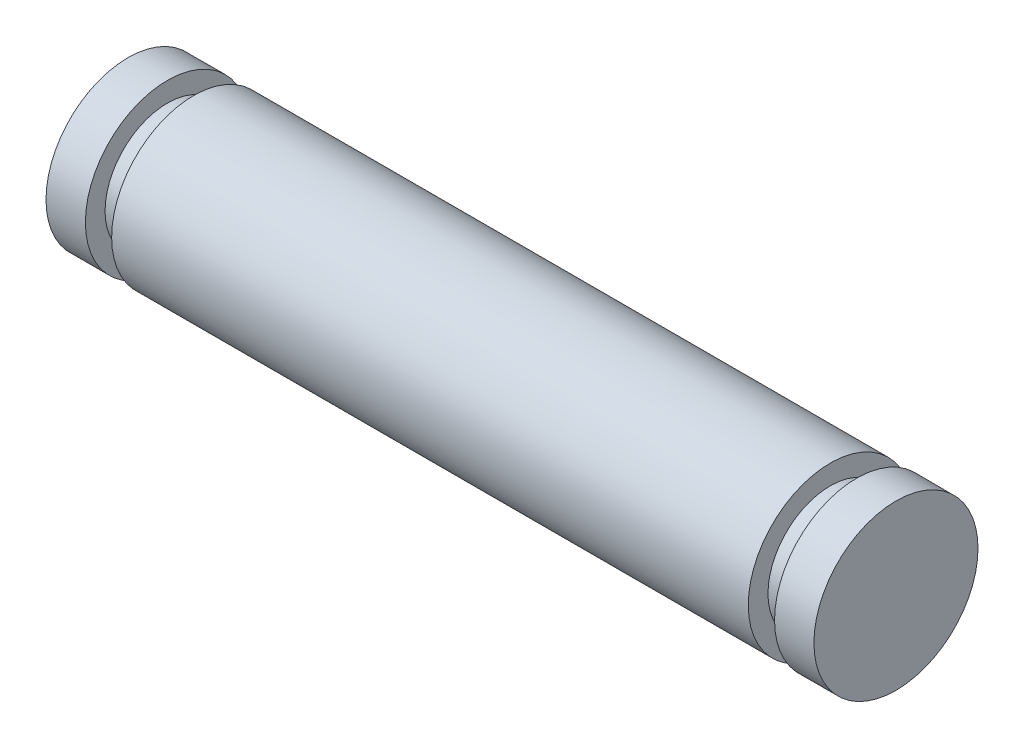
ISO-10303-21;
HEADER;
FILE_DESCRIPTION(('STEP AP214'),'2;1');
FILE_NAME('part.step','',(''),(''),'','','');
FILE_SCHEMA(('AUTOMOTIVE_DESIGN { 1 0 10303 214 1 1 1 1 }'));
ENDSEC;
DATA;
#1=APPLICATION_CONTEXT('core data for automotive mechanical design processes');
#2=APPLICATION_PROTOCOL_DEFINITION('international standard','automotive_design',2000,#1);
#3=PRODUCT_CONTEXT('',#1,'mechanical');
#4=PRODUCT('Part','Part','',(#3));
#5=PRODUCT_RELATED_PRODUCT_CATEGORY('part','',(#4));
#6=PRODUCT_DEFINITION_FORMATION('','',#4);
#7=PRODUCT_DEFINITION_CONTEXT('part definition',#1,'design');
#8=PRODUCT_DEFINITION('design','',#6,#7);
#9=PRODUCT_DEFINITION_SHAPE('','',#8);
#10=(LENGTH_UNIT() NAMED_UNIT(*) SI_UNIT(.MILLI.,.METRE.));
#11=(NAMED_UNIT(*) PLANE_ANGLE_UNIT() SI_UNIT($,.RADIAN.));
#12=(NAMED_UNIT(*) SI_UNIT($,.STERADIAN.) SOLID_ANGLE_UNIT());
#13=UNCERTAINTY_MEASURE_WITH_UNIT(LENGTH_MEASURE(1.E-05),#10,'distance_accuracy_value','');
#14=(GEOMETRIC_REPRESENTATION_CONTEXT(3) GLOBAL_UNCERTAINTY_ASSIGNED_CONTEXT((#13)) GLOBAL_UNIT_ASSIGNED_CONTEXT((#10,
#11,#12)) REPRESENTATION_CONTEXT('',''));
#15=CARTESIAN_POINT('',(0.,0.,0.));
#16=DIRECTION('',(0.,0.,1.));
#17=DIRECTION('',(1.,0.,0.));
#18=AXIS2_PLACEMENT_3D('',#15,#16,#17);
#19=CARTESIAN_POINT('',(7.4295,0.,0.));
#20=DIRECTION('',(-1.,0.,0.));
#21=DIRECTION('',(0.,0.,1.));
#22=AXIS2_PLACEMENT_3D('',#19,#20,#21);
#23=CYLINDRICAL_SURFACE('',#22,1.5875);
#24=CARTESIAN_POINT('',(-6.1595,0.,0.));
#25=DIRECTION('',(-1.,0.,0.));
#26=DIRECTION('',(0.,0.,1.));
#27=AXIS2_PLACEMENT_3D('',#24,#25,#26);
#28=CIRCLE('',#27,1.5875);
#29=CARTESIAN_POINT('',(-6.1595,0.,1.5875));
#30=VERTEX_POINT('',#29);
#31=EDGE_CURVE('E390',#30,#30,#28,.T.);
#32=ORIENTED_EDGE('',*,*,#31,.F.);
#33=EDGE_LOOP('',(#32));
#34=FACE_BOUND('',#33,.T.);
#35=CARTESIAN_POINT('',(6.1595,0.,0.));
#36=DIRECTION('',(-1.,0.,0.));
#37=DIRECTION('',(0.,0.,1.));
#38=AXIS2_PLACEMENT_3D('',#35,#36,#37);
#39=CIRCLE('',#38,1.5875);
#40=CARTESIAN_POINT('',(6.1595,0.,1.5875));
#41=VERTEX_POINT('',#40);
#42=EDGE_CURVE('E405',#41,#41,#39,.T.);
#43=ORIENTED_EDGE('',*,*,#42,.T.);
#44=EDGE_LOOP('',(#43));
#45=FACE_BOUND('',#44,.T.);
#46=ADVANCED_FACE('F370',(#34,#45),#23,.T.);
#47=CARTESIAN_POINT('',(-7.4295,0.,0.));
#48=DIRECTION('',(1.,0.,0.));
#49=DIRECTION('',(0.,0.,-1.));
#50=AXIS2_PLACEMENT_3D('',#47,#48,#49);
#51=CIRCLE('',#50,1.5875);
#52=CARTESIAN_POINT('',(-7.4295,0.,-1.5875));
#53=VERTEX_POINT('',#52);
#54=EDGE_CURVE('E377',#53,#53,#51,.T.);
#55=ORIENTED_EDGE('',*,*,#54,.T.);
#56=EDGE_LOOP('',(#55));
#57=FACE_BOUND('',#56,.T.);
#58=CARTESIAN_POINT('',(-6.6675,0.,0.));
#59=DIRECTION('',(-1.,0.,0.));
#60=DIRECTION('',(0.,0.,1.));
#61=AXIS2_PLACEMENT_3D('',#58,#59,#60);
#62=CIRCLE('',#61,1.5875);
#63=CARTESIAN_POINT('',(-6.6675,0.,1.5875));
#64=VERTEX_POINT('',#63);
#65=EDGE_CURVE('E393',#64,#64,#62,.T.);
#66=ORIENTED_EDGE('',*,*,#65,.T.);
#67=EDGE_LOOP('',(#66));
#68=FACE_BOUND('',#67,.T.);
#69=ADVANCED_FACE('F372',(#57,#68),#23,.T.);
#70=CARTESIAN_POINT('',(-7.4295,0.,0.));
#71=DIRECTION('',(1.,0.,0.));
#72=DIRECTION('',(0.,0.,-1.));
#73=AXIS2_PLACEMENT_3D('',#70,#71,#72);
#74=PLANE('',#73);
#75=ORIENTED_EDGE('',*,*,#54,.F.);
#76=EDGE_LOOP('',(#75));
#77=FACE_BOUND('',#76,.T.);
#78=ADVANCED_FACE('F433',(#77),#74,.F.);
#79=CARTESIAN_POINT('',(-6.6675,1.5875,0.));
#80=DIRECTION('',(1.,0.,0.));
#81=DIRECTION('',(0.,0.,-1.));
#82=AXIS2_PLACEMENT_3D('',#79,#80,#81);
#83=PLANE('',#82);
#84=CARTESIAN_POINT('',(-6.6675,0.,0.));
#85=DIRECTION('',(-1.,0.,0.));
#86=DIRECTION('',(0.,0.,1.));
#87=AXIS2_PLACEMENT_3D('',#84,#85,#86);
#88=CIRCLE('',#87,1.2065);
#89=CARTESIAN_POINT('',(-6.6675,0.,1.2065));
#90=VERTEX_POINT('',#89);
#91=EDGE_CURVE('E381',#90,#90,#88,.T.);
#92=ORIENTED_EDGE('',*,*,#91,.T.);
#93=EDGE_LOOP('',(#92));
#94=FACE_BOUND('',#93,.T.);
#95=ORIENTED_EDGE('',*,*,#65,.F.);
#96=EDGE_LOOP('',(#95));
#97=FACE_BOUND('',#96,.T.);
#98=ADVANCED_FACE('F469',(#94,#97),#83,.T.);
#99=CARTESIAN_POINT('',(-7.4295,0.,0.));
#100=DIRECTION('',(-1.,0.,0.));
#101=DIRECTION('',(0.,0.,1.));
#102=AXIS2_PLACEMENT_3D('',#99,#100,#101);
#103=CYLINDRICAL_SURFACE('',#102,1.2065);
#104=CARTESIAN_POINT('',(-6.1595,0.,0.));
#105=DIRECTION('',(-1.,0.,0.));
#106=DIRECTION('',(0.,0.,1.));
#107=AXIS2_PLACEMENT_3D('',#104,#105,#106);
#108=CIRCLE('',#107,1.2065);
#109=CARTESIAN_POINT('',(-6.1595,0.,1.2065));
#110=VERTEX_POINT('',#109);
#111=EDGE_CURVE('E385',#110,#110,#108,.T.);
#112=ORIENTED_EDGE('',*,*,#111,.T.);
#113=EDGE_LOOP('',(#112));
#114=FACE_BOUND('',#113,.T.);
#115=ORIENTED_EDGE('',*,*,#91,.F.);
#116=EDGE_LOOP('',(#115));
#117=FACE_BOUND('',#116,.T.);
#118=ADVANCED_FACE('F423',(#114,#117),#103,.T.);
#119=CARTESIAN_POINT('',(-6.1595,1.5875,0.));
#120=DIRECTION('',(-1.,0.,0.));
#121=DIRECTION('',(0.,0.,1.));
#122=AXIS2_PLACEMENT_3D('',#119,#120,#121);
#123=PLANE('',#122);
#124=ORIENTED_EDGE('',*,*,#31,.T.);
#125=EDGE_LOOP('',(#124));
#126=FACE_BOUND('',#125,.T.);
#127=ORIENTED_EDGE('',*,*,#111,.F.);
#128=EDGE_LOOP('',(#127));
#129=FACE_BOUND('',#128,.T.);
#130=ADVANCED_FACE('F413',(#126,#129),#123,.T.);
#131=CARTESIAN_POINT('',(6.1595,1.5875,0.));
#132=DIRECTION('',(1.,0.,0.));
#133=DIRECTION('',(0.,0.,-1.));
#134=AXIS2_PLACEMENT_3D('',#131,#132,#133);
#135=PLANE('',#134);
#136=CARTESIAN_POINT('',(6.1595,0.,0.));
#137=DIRECTION('',(-1.,0.,0.));
#138=DIRECTION('',(0.,0.,1.));
#139=AXIS2_PLACEMENT_3D('',#136,#137,#138);
#140=CIRCLE('',#139,1.2065);
#141=CARTESIAN_POINT('',(6.1595,0.,1.2065));
#142=VERTEX_POINT('',#141);
#143=EDGE_CURVE('E396',#142,#142,#140,.T.);
#144=ORIENTED_EDGE('',*,*,#143,.T.);
#145=EDGE_LOOP('',(#144));
#146=FACE_BOUND('',#145,.T.);
#147=ORIENTED_EDGE('',*,*,#42,.F.);
#148=EDGE_LOOP('',(#147));
#149=FACE_BOUND('',#148,.T.);
#150=ADVANCED_FACE('F410',(#146,#149),#135,.T.);
#151=CARTESIAN_POINT('',(-7.4295,0.,0.));
#152=DIRECTION('',(-1.,0.,0.));
#153=DIRECTION('',(0.,0.,1.));
#154=AXIS2_PLACEMENT_3D('',#151,#152,#153);
#155=CYLINDRICAL_SURFACE('',#154,1.2065);
#156=CARTESIAN_POINT('',(6.6675,0.,0.));
#157=DIRECTION('',(-1.,0.,0.));
#158=DIRECTION('',(0.,0.,1.));
#159=AXIS2_PLACEMENT_3D('',#156,#157,#158);
#160=CIRCLE('',#159,1.2065);
#161=CARTESIAN_POINT('',(6.6675,0.,1.2065));
#162=VERTEX_POINT('',#161);
#163=EDGE_CURVE('E399',#162,#162,#160,.T.);
#164=ORIENTED_EDGE('',*,*,#163,.T.);
#165=EDGE_LOOP('',(#164));
#166=FACE_BOUND('',#165,.T.);
#167=ORIENTED_EDGE('',*,*,#143,.F.);
#168=EDGE_LOOP('',(#167));
#169=FACE_BOUND('',#168,.T.);
#170=ADVANCED_FACE('F412',(#166,#169),#155,.T.);
#171=CARTESIAN_POINT('',(6.6675,1.5875,0.));
#172=DIRECTION('',(-1.,0.,0.));
#173=DIRECTION('',(0.,0.,1.));
#174=AXIS2_PLACEMENT_3D('',#171,#172,#173);
#175=PLANE('',#174);
#176=CARTESIAN_POINT('',(6.6675,0.,0.));
#177=DIRECTION('',(-1.,0.,0.));
#178=DIRECTION('',(0.,0.,1.));
#179=AXIS2_PLACEMENT_3D('',#176,#177,#178);
#180=CIRCLE('',#179,1.5875);
#181=CARTESIAN_POINT('',(6.6675,0.,1.5875));
#182=VERTEX_POINT('',#181);
#183=EDGE_CURVE('E402',#182,#182,#180,.T.);
#184=ORIENTED_EDGE('',*,*,#183,.T.);
#185=EDGE_LOOP('',(#184));
#186=FACE_BOUND('',#185,.T.);
#187=ORIENTED_EDGE('',*,*,#163,.F.);
#188=EDGE_LOOP('',(#187));
#189=FACE_BOUND('',#188,.T.);
#190=ADVANCED_FACE('F420',(#186,#189),#175,.T.);
#191=CARTESIAN_POINT('',(7.4295,0.,0.));
#192=DIRECTION('',(1.,0.,0.));
#193=DIRECTION('',(0.,0.,-1.));
#194=AXIS2_PLACEMENT_3D('',#191,#192,#193);
#195=PLANE('',#194);
#196=CARTESIAN_POINT('',(7.4295,0.,0.));
#197=DIRECTION('',(1.,0.,0.));
#198=DIRECTION('',(0.,0.,-1.));
#199=AXIS2_PLACEMENT_3D('',#196,#197,#198);
#200=CIRCLE('',#199,1.5875);
#201=CARTESIAN_POINT('',(7.4295,0.,-1.5875));
#202=VERTEX_POINT('',#201);
#203=EDGE_CURVE('E10',#202,#202,#200,.T.);
#204=ORIENTED_EDGE('',*,*,#203,.T.);
#205=EDGE_LOOP('',(#204));
#206=FACE_BOUND('',#205,.T.);
#207=ADVANCED_FACE('F436',(#206),#195,.T.);
#208=ORIENTED_EDGE('',*,*,#203,.F.);
#209=EDGE_LOOP('',(#208));
#210=FACE_BOUND('',#209,.T.);
#211=ORIENTED_EDGE('',*,*,#183,.F.);
#212=EDGE_LOOP('',(#211));
#213=FACE_BOUND('',#212,.T.);
#214=ADVANCED_FACE('F428',(#210,#213),#23,.T.);
#215=CLOSED_SHELL('',(#46,#69,#78,#98,#118,#130,#150,#170,#190,#207,#214));
#216=MANIFOLD_SOLID_BREP('B2',#215);
#217=ADVANCED_BREP_SHAPE_REPRESENTATION('',(#18,#216),#14);
#218=SHAPE_DEFINITION_REPRESENTATION(#9,#217);
ENDSEC;
END-ISO-10303-21;
